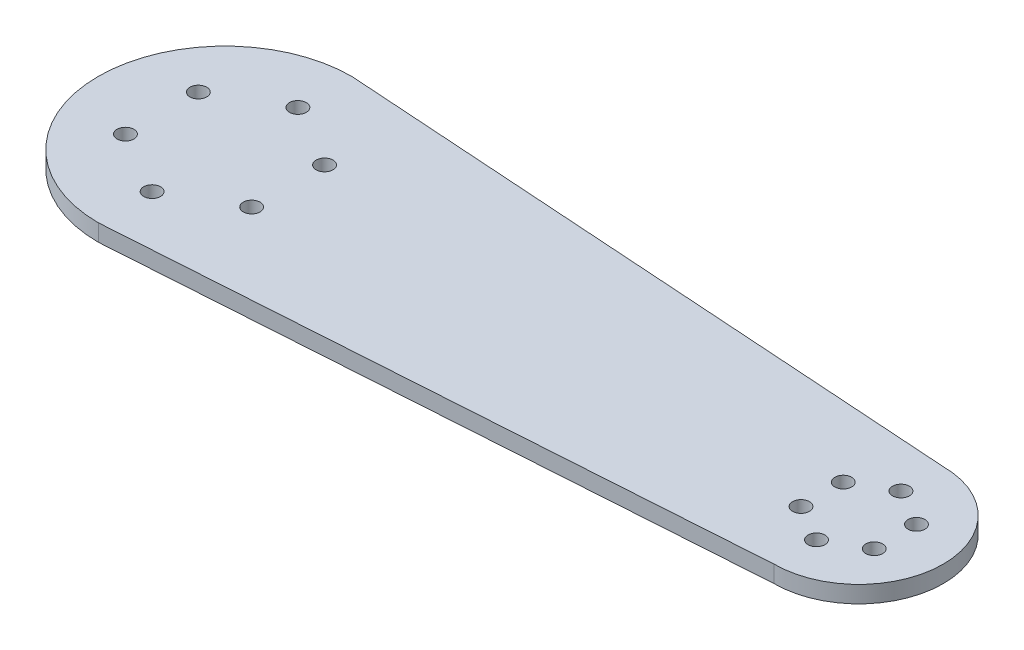
ISO-10303-21;
HEADER;
FILE_DESCRIPTION(('STEP AP214'),'2;1');
FILE_NAME('part.step','',(''),(''),'','','');
FILE_SCHEMA(('AUTOMOTIVE_DESIGN { 1 0 10303 214 1 1 1 1 }'));
ENDSEC;
DATA;
#1=APPLICATION_CONTEXT('core data for automotive mechanical design processes');
#2=APPLICATION_PROTOCOL_DEFINITION('international standard','automotive_design',2000,#1);
#3=PRODUCT_CONTEXT('',#1,'mechanical');
#4=PRODUCT('Part','Part','',(#3));
#5=PRODUCT_RELATED_PRODUCT_CATEGORY('part','',(#4));
#6=PRODUCT_DEFINITION_FORMATION('','',#4);
#7=PRODUCT_DEFINITION_CONTEXT('part definition',#1,'design');
#8=PRODUCT_DEFINITION('design','',#6,#7);
#9=PRODUCT_DEFINITION_SHAPE('','',#8);
#10=(LENGTH_UNIT() NAMED_UNIT(*) SI_UNIT(.MILLI.,.METRE.));
#11=(NAMED_UNIT(*) PLANE_ANGLE_UNIT() SI_UNIT($,.RADIAN.));
#12=(NAMED_UNIT(*) SI_UNIT($,.STERADIAN.) SOLID_ANGLE_UNIT());
#13=UNCERTAINTY_MEASURE_WITH_UNIT(LENGTH_MEASURE(1.E-05),#10,'distance_accuracy_value','');
#14=(GEOMETRIC_REPRESENTATION_CONTEXT(3) GLOBAL_UNCERTAINTY_ASSIGNED_CONTEXT((#13)) GLOBAL_UNIT_ASSIGNED_CONTEXT((#10,
#11,#12)) REPRESENTATION_CONTEXT('',''));
#15=CARTESIAN_POINT('',(0.,0.,0.));
#16=DIRECTION('',(0.,0.,1.));
#17=DIRECTION('',(1.,0.,0.));
#18=AXIS2_PLACEMENT_3D('',#15,#16,#17);
#19=CARTESIAN_POINT('',(1.99115044247788,4.,29.8672566371681));
#20=DIRECTION('',(-0.0665190105237739,0.,-0.997785157856609));
#21=DIRECTION('',(-0.997785157856609,0.,0.0665190105237739));
#22=AXIS2_PLACEMENT_3D('',#19,#20,#21);
#23=PLANE('',#22);
#24=DIRECTION('',(0.997785157856609,0.,-0.0665190105237739));
#25=VECTOR('',#24,1.);
#26=CARTESIAN_POINT('',(1.99115044247788,0.,29.8672566371681));
#27=LINE('',#26,#25);
#28=CARTESIAN_POINT('',(0.,0.,30.));
#29=VERTEX_POINT('',#28);
#30=CARTESIAN_POINT('',(150.,0.,20.));
#31=VERTEX_POINT('',#30);
#32=EDGE_CURVE('E164',#29,#31,#27,.T.);
#33=ORIENTED_EDGE('',*,*,#32,.T.);
#34=DIRECTION('',(0.,-1.,0.));
#35=VECTOR('',#34,1.);
#36=CARTESIAN_POINT('',(150.,4.,20.));
#37=LINE('',#36,#35);
#38=CARTESIAN_POINT('',(150.,4.,20.));
#39=VERTEX_POINT('',#38);
#40=EDGE_CURVE('E11',#39,#31,#37,.T.);
#41=ORIENTED_EDGE('',*,*,#40,.F.);
#42=DIRECTION('',(0.997785157856609,0.,-0.0665190105237739));
#43=VECTOR('',#42,1.);
#44=CARTESIAN_POINT('',(1.99115044247788,4.,29.8672566371681));
#45=LINE('',#44,#43);
#46=CARTESIAN_POINT('',(0.,4.,30.));
#47=VERTEX_POINT('',#46);
#48=EDGE_CURVE('E97',#47,#39,#45,.T.);
#49=ORIENTED_EDGE('',*,*,#48,.F.);
#50=DIRECTION('',(0.,-1.,0.));
#51=VECTOR('',#50,1.);
#52=CARTESIAN_POINT('',(0.,4.,30.));
#53=LINE('',#52,#51);
#54=EDGE_CURVE('E123',#47,#29,#53,.T.);
#55=ORIENTED_EDGE('',*,*,#54,.T.);
#56=EDGE_LOOP('',(#33,#41,#49,#55));
#57=FACE_BOUND('',#56,.T.);
#58=ADVANCED_FACE('F47',(#57),#23,.F.);
#59=CARTESIAN_POINT('',(150.,4.,0.));
#60=DIRECTION('',(0.,-1.,0.));
#61=DIRECTION('',(0.,0.,-1.));
#62=AXIS2_PLACEMENT_3D('',#59,#60,#61);
#63=CYLINDRICAL_SURFACE('',#62,20.);
#64=CARTESIAN_POINT('',(150.,0.,0.));
#65=DIRECTION('',(0.,1.,0.));
#66=DIRECTION('',(0.,0.,1.));
#67=AXIS2_PLACEMENT_3D('',#64,#65,#66);
#68=CIRCLE('',#67,20.);
#69=CARTESIAN_POINT('',(150.,0.,-20.));
#70=VERTEX_POINT('',#69);
#71=EDGE_CURVE('E103',#31,#70,#68,.T.);
#72=ORIENTED_EDGE('',*,*,#71,.T.);
#73=DIRECTION('',(0.,-1.,0.));
#74=VECTOR('',#73,1.);
#75=CARTESIAN_POINT('',(150.,4.,-20.));
#76=LINE('',#75,#74);
#77=CARTESIAN_POINT('',(150.,4.,-20.));
#78=VERTEX_POINT('',#77);
#79=EDGE_CURVE('E57',#78,#70,#76,.T.);
#80=ORIENTED_EDGE('',*,*,#79,.F.);
#81=CARTESIAN_POINT('',(150.,4.,0.));
#82=DIRECTION('',(0.,1.,0.));
#83=DIRECTION('',(0.,0.,1.));
#84=AXIS2_PLACEMENT_3D('',#81,#82,#83);
#85=CIRCLE('',#84,20.);
#86=EDGE_CURVE('E91',#39,#78,#85,.T.);
#87=ORIENTED_EDGE('',*,*,#86,.F.);
#88=ORIENTED_EDGE('',*,*,#40,.T.);
#89=EDGE_LOOP('',(#72,#80,#87,#88));
#90=FACE_BOUND('',#89,.T.);
#91=ADVANCED_FACE('F102',(#90),#63,.T.);
#92=CARTESIAN_POINT('',(1.99115044247788,4.,-29.8672566371681));
#93=DIRECTION('',(0.0665190105237739,0.,-0.997785157856609));
#94=DIRECTION('',(-0.997785157856609,0.,-0.0665190105237739));
#95=AXIS2_PLACEMENT_3D('',#92,#93,#94);
#96=PLANE('',#95);
#97=DIRECTION('',(0.997785157856609,0.,0.0665190105237739));
#98=VECTOR('',#97,1.);
#99=CARTESIAN_POINT('',(1.99115044247788,0.,-29.8672566371681));
#100=LINE('',#99,#98);
#101=CARTESIAN_POINT('',(0.,0.,-30.));
#102=VERTEX_POINT('',#101);
#103=EDGE_CURVE('E170',#102,#70,#100,.T.);
#104=ORIENTED_EDGE('',*,*,#103,.F.);
#105=DIRECTION('',(0.,-1.,0.));
#106=VECTOR('',#105,1.);
#107=CARTESIAN_POINT('',(0.,4.,-30.));
#108=LINE('',#107,#106);
#109=CARTESIAN_POINT('',(0.,4.,-30.));
#110=VERTEX_POINT('',#109);
#111=EDGE_CURVE('E81',#110,#102,#108,.T.);
#112=ORIENTED_EDGE('',*,*,#111,.F.);
#113=DIRECTION('',(0.997785157856609,0.,0.0665190105237739));
#114=VECTOR('',#113,1.);
#115=CARTESIAN_POINT('',(1.99115044247788,4.,-29.8672566371681));
#116=LINE('',#115,#114);
#117=EDGE_CURVE('E95',#110,#78,#116,.T.);
#118=ORIENTED_EDGE('',*,*,#117,.T.);
#119=ORIENTED_EDGE('',*,*,#79,.T.);
#120=EDGE_LOOP('',(#104,#112,#118,#119));
#121=FACE_BOUND('',#120,.T.);
#122=ADVANCED_FACE('F108',(#121),#96,.T.);
#123=CARTESIAN_POINT('',(-14.9389382152816,4.,8.62499999999986));
#124=DIRECTION('',(0.,-1.,0.));
#125=DIRECTION('',(0.,0.,-1.));
#126=AXIS2_PLACEMENT_3D('',#123,#124,#125);
#127=CYLINDRICAL_SURFACE('',#126,2.);
#128=CARTESIAN_POINT('',(-14.9389382152816,4.,8.62499999999986));
#129=DIRECTION('',(0.,1.,0.));
#130=DIRECTION('',(0.,0.,1.));
#131=AXIS2_PLACEMENT_3D('',#128,#129,#130);
#132=CIRCLE('',#131,2.);
#133=CARTESIAN_POINT('',(-14.9389382152816,4.,10.6249999999999));
#134=VERTEX_POINT('',#133);
#135=EDGE_CURVE('E112',#134,#134,#132,.T.);
#136=ORIENTED_EDGE('',*,*,#135,.T.);
#137=EDGE_LOOP('',(#136));
#138=FACE_BOUND('',#137,.T.);
#139=CARTESIAN_POINT('',(-14.9389382152816,0.,8.62499999999986));
#140=DIRECTION('',(0.,1.,0.));
#141=DIRECTION('',(0.,0.,1.));
#142=AXIS2_PLACEMENT_3D('',#139,#140,#141);
#143=CIRCLE('',#142,2.);
#144=CARTESIAN_POINT('',(-14.9389382152816,0.,10.6249999999999));
#145=VERTEX_POINT('',#144);
#146=EDGE_CURVE('E175',#145,#145,#143,.T.);
#147=ORIENTED_EDGE('',*,*,#146,.F.);
#148=EDGE_LOOP('',(#147));
#149=FACE_BOUND('',#148,.T.);
#150=ADVANCED_FACE('F446',(#138,#149),#127,.F.);
#151=CARTESIAN_POINT('',(0.,4.,0.));
#152=DIRECTION('',(0.,-1.,0.));
#153=DIRECTION('',(0.,0.,-1.));
#154=AXIS2_PLACEMENT_3D('',#151,#152,#153);
#155=CYLINDRICAL_SURFACE('',#154,30.);
#156=CARTESIAN_POINT('',(0.,0.,0.));
#157=DIRECTION('',(0.,1.,0.));
#158=DIRECTION('',(0.,0.,1.));
#159=AXIS2_PLACEMENT_3D('',#156,#157,#158);
#160=CIRCLE('',#159,30.);
#161=EDGE_CURVE('E84',#102,#29,#160,.T.);
#162=ORIENTED_EDGE('',*,*,#161,.T.);
#163=ORIENTED_EDGE('',*,*,#54,.F.);
#164=CARTESIAN_POINT('',(0.,4.,0.));
#165=DIRECTION('',(0.,1.,0.));
#166=DIRECTION('',(0.,0.,1.));
#167=AXIS2_PLACEMENT_3D('',#164,#165,#166);
#168=CIRCLE('',#167,30.);
#169=EDGE_CURVE('E65',#110,#47,#168,.T.);
#170=ORIENTED_EDGE('',*,*,#169,.F.);
#171=ORIENTED_EDGE('',*,*,#111,.T.);
#172=EDGE_LOOP('',(#162,#163,#170,#171));
#173=FACE_BOUND('',#172,.T.);
#174=ADVANCED_FACE('F224',(#173),#155,.T.);
#175=CARTESIAN_POINT('',(-1.20456106190088E-13,4.,17.25));
#176=DIRECTION('',(0.,-1.,0.));
#177=DIRECTION('',(0.,0.,-1.));
#178=AXIS2_PLACEMENT_3D('',#175,#176,#177);
#179=CYLINDRICAL_SURFACE('',#178,2.);
#180=CARTESIAN_POINT('',(-1.20456106190088E-13,4.,17.25));
#181=DIRECTION('',(0.,1.,0.));
#182=DIRECTION('',(0.,0.,1.));
#183=AXIS2_PLACEMENT_3D('',#180,#181,#182);
#184=CIRCLE('',#183,2.);
#185=CARTESIAN_POINT('',(-1.20456106190088E-13,4.,19.25));
#186=VERTEX_POINT('',#185);
#187=EDGE_CURVE('E321',#186,#186,#184,.T.);
#188=ORIENTED_EDGE('',*,*,#187,.T.);
#189=EDGE_LOOP('',(#188));
#190=FACE_BOUND('',#189,.T.);
#191=CARTESIAN_POINT('',(-1.20456106190088E-13,0.,17.25));
#192=DIRECTION('',(0.,1.,0.));
#193=DIRECTION('',(0.,0.,1.));
#194=AXIS2_PLACEMENT_3D('',#191,#192,#193);
#195=CIRCLE('',#194,2.);
#196=CARTESIAN_POINT('',(-1.20456106190088E-13,0.,19.25));
#197=VERTEX_POINT('',#196);
#198=EDGE_CURVE('E160',#197,#197,#195,.T.);
#199=ORIENTED_EDGE('',*,*,#198,.F.);
#200=EDGE_LOOP('',(#199));
#201=FACE_BOUND('',#200,.T.);
#202=ADVANCED_FACE('F220',(#190,#201),#179,.F.);
#203=CARTESIAN_POINT('',(14.9389382152815,4.,8.62500000000007));
#204=DIRECTION('',(0.,-1.,0.));
#205=DIRECTION('',(0.,0.,-1.));
#206=AXIS2_PLACEMENT_3D('',#203,#204,#205);
#207=CYLINDRICAL_SURFACE('',#206,2.);
#208=CARTESIAN_POINT('',(14.9389382152815,4.,8.62500000000007));
#209=DIRECTION('',(0.,1.,0.));
#210=DIRECTION('',(0.,0.,1.));
#211=AXIS2_PLACEMENT_3D('',#208,#209,#210);
#212=CIRCLE('',#211,2.);
#213=CARTESIAN_POINT('',(14.9389382152815,4.,10.6250000000001));
#214=VERTEX_POINT('',#213);
#215=EDGE_CURVE('E317',#214,#214,#212,.T.);
#216=ORIENTED_EDGE('',*,*,#215,.T.);
#217=EDGE_LOOP('',(#216));
#218=FACE_BOUND('',#217,.T.);
#219=CARTESIAN_POINT('',(14.9389382152815,0.,8.62500000000007));
#220=DIRECTION('',(0.,1.,0.));
#221=DIRECTION('',(0.,0.,1.));
#222=AXIS2_PLACEMENT_3D('',#219,#220,#221);
#223=CIRCLE('',#222,2.);
#224=CARTESIAN_POINT('',(14.9389382152815,0.,10.6250000000001));
#225=VERTEX_POINT('',#224);
#226=EDGE_CURVE('E156',#225,#225,#223,.T.);
#227=ORIENTED_EDGE('',*,*,#226,.F.);
#228=EDGE_LOOP('',(#227));
#229=FACE_BOUND('',#228,.T.);
#230=ADVANCED_FACE('F223',(#218,#229),#207,.F.);
#231=CARTESIAN_POINT('',(14.9389382152816,4.,-8.62499999999997));
#232=DIRECTION('',(0.,-1.,0.));
#233=DIRECTION('',(0.,0.,-1.));
#234=AXIS2_PLACEMENT_3D('',#231,#232,#233);
#235=CYLINDRICAL_SURFACE('',#234,2.);
#236=CARTESIAN_POINT('',(14.9389382152816,4.,-8.62499999999997));
#237=DIRECTION('',(0.,1.,0.));
#238=DIRECTION('',(0.,0.,1.));
#239=AXIS2_PLACEMENT_3D('',#236,#237,#238);
#240=CIRCLE('',#239,2.);
#241=CARTESIAN_POINT('',(14.9389382152816,4.,-6.62499999999996));
#242=VERTEX_POINT('',#241);
#243=EDGE_CURVE('E313',#242,#242,#240,.T.);
#244=ORIENTED_EDGE('',*,*,#243,.T.);
#245=EDGE_LOOP('',(#244));
#246=FACE_BOUND('',#245,.T.);
#247=CARTESIAN_POINT('',(14.9389382152816,0.,-8.62499999999997));
#248=DIRECTION('',(0.,1.,0.));
#249=DIRECTION('',(0.,0.,1.));
#250=AXIS2_PLACEMENT_3D('',#247,#248,#249);
#251=CIRCLE('',#250,2.);
#252=CARTESIAN_POINT('',(14.9389382152816,0.,-6.62499999999996));
#253=VERTEX_POINT('',#252);
#254=EDGE_CURVE('E152',#253,#253,#251,.T.);
#255=ORIENTED_EDGE('',*,*,#254,.F.);
#256=EDGE_LOOP('',(#255));
#257=FACE_BOUND('',#256,.T.);
#258=ADVANCED_FACE('F228',(#246,#257),#235,.F.);
#259=CARTESIAN_POINT('',(0.,4.,-17.25));
#260=DIRECTION('',(0.,-1.,0.));
#261=DIRECTION('',(0.,0.,-1.));
#262=AXIS2_PLACEMENT_3D('',#259,#260,#261);
#263=CYLINDRICAL_SURFACE('',#262,2.);
#264=CARTESIAN_POINT('',(0.,4.,-17.25));
#265=DIRECTION('',(0.,1.,0.));
#266=DIRECTION('',(0.,0.,1.));
#267=AXIS2_PLACEMENT_3D('',#264,#265,#266);
#268=CIRCLE('',#267,2.);
#269=CARTESIAN_POINT('',(0.,4.,-15.25));
#270=VERTEX_POINT('',#269);
#271=EDGE_CURVE('E309',#270,#270,#268,.T.);
#272=ORIENTED_EDGE('',*,*,#271,.T.);
#273=EDGE_LOOP('',(#272));
#274=FACE_BOUND('',#273,.T.);
#275=CARTESIAN_POINT('',(0.,0.,-17.25));
#276=DIRECTION('',(0.,1.,0.));
#277=DIRECTION('',(0.,0.,1.));
#278=AXIS2_PLACEMENT_3D('',#275,#276,#277);
#279=CIRCLE('',#278,2.);
#280=CARTESIAN_POINT('',(0.,0.,-15.25));
#281=VERTEX_POINT('',#280);
#282=EDGE_CURVE('E148',#281,#281,#279,.T.);
#283=ORIENTED_EDGE('',*,*,#282,.F.);
#284=EDGE_LOOP('',(#283));
#285=FACE_BOUND('',#284,.T.);
#286=ADVANCED_FACE('F232',(#274,#285),#263,.F.);
#287=CARTESIAN_POINT('',(-14.9389382152815,4.,-8.62500000000018));
#288=DIRECTION('',(0.,-1.,0.));
#289=DIRECTION('',(0.,0.,-1.));
#290=AXIS2_PLACEMENT_3D('',#287,#288,#289);
#291=CYLINDRICAL_SURFACE('',#290,2.);
#292=CARTESIAN_POINT('',(-14.9389382152815,4.,-8.62500000000018));
#293=DIRECTION('',(0.,1.,0.));
#294=DIRECTION('',(0.,0.,1.));
#295=AXIS2_PLACEMENT_3D('',#292,#293,#294);
#296=CIRCLE('',#295,2.);
#297=CARTESIAN_POINT('',(-14.9389382152815,4.,-6.62500000000017));
#298=VERTEX_POINT('',#297);
#299=EDGE_CURVE('E305',#298,#298,#296,.T.);
#300=ORIENTED_EDGE('',*,*,#299,.T.);
#301=EDGE_LOOP('',(#300));
#302=FACE_BOUND('',#301,.T.);
#303=CARTESIAN_POINT('',(-14.9389382152815,0.,-8.62500000000018));
#304=DIRECTION('',(0.,1.,0.));
#305=DIRECTION('',(0.,0.,1.));
#306=AXIS2_PLACEMENT_3D('',#303,#304,#305);
#307=CIRCLE('',#306,2.);
#308=CARTESIAN_POINT('',(-14.9389382152815,0.,-6.62500000000017));
#309=VERTEX_POINT('',#308);
#310=EDGE_CURVE('E144',#309,#309,#307,.T.);
#311=ORIENTED_EDGE('',*,*,#310,.F.);
#312=EDGE_LOOP('',(#311));
#313=FACE_BOUND('',#312,.T.);
#314=ADVANCED_FACE('F236',(#302,#313),#291,.F.);
#315=CARTESIAN_POINT('',(150.,4.,10.));
#316=DIRECTION('',(0.,-1.,0.));
#317=DIRECTION('',(0.,0.,-1.));
#318=AXIS2_PLACEMENT_3D('',#315,#316,#317);
#319=CYLINDRICAL_SURFACE('',#318,2.);
#320=CARTESIAN_POINT('',(150.,4.,10.));
#321=DIRECTION('',(0.,1.,0.));
#322=DIRECTION('',(0.,0.,1.));
#323=AXIS2_PLACEMENT_3D('',#320,#321,#322);
#324=CIRCLE('',#323,2.);
#325=CARTESIAN_POINT('',(150.,4.,12.));
#326=VERTEX_POINT('',#325);
#327=EDGE_CURVE('E301',#326,#326,#324,.T.);
#328=ORIENTED_EDGE('',*,*,#327,.T.);
#329=EDGE_LOOP('',(#328));
#330=FACE_BOUND('',#329,.T.);
#331=CARTESIAN_POINT('',(150.,0.,10.));
#332=DIRECTION('',(0.,1.,0.));
#333=DIRECTION('',(0.,0.,1.));
#334=AXIS2_PLACEMENT_3D('',#331,#332,#333);
#335=CIRCLE('',#334,2.);
#336=CARTESIAN_POINT('',(150.,0.,12.));
#337=VERTEX_POINT('',#336);
#338=EDGE_CURVE('E140',#337,#337,#335,.T.);
#339=ORIENTED_EDGE('',*,*,#338,.F.);
#340=EDGE_LOOP('',(#339));
#341=FACE_BOUND('',#340,.T.);
#342=ADVANCED_FACE('F240',(#330,#341),#319,.F.);
#343=CARTESIAN_POINT('',(158.660254037844,4.,5.));
#344=DIRECTION('',(0.,-1.,0.));
#345=DIRECTION('',(0.,0.,-1.));
#346=AXIS2_PLACEMENT_3D('',#343,#344,#345);
#347=CYLINDRICAL_SURFACE('',#346,2.);
#348=CARTESIAN_POINT('',(158.660254037844,4.,5.));
#349=DIRECTION('',(0.,1.,0.));
#350=DIRECTION('',(0.,0.,1.));
#351=AXIS2_PLACEMENT_3D('',#348,#349,#350);
#352=CIRCLE('',#351,2.);
#353=CARTESIAN_POINT('',(158.660254037844,4.,7.));
#354=VERTEX_POINT('',#353);
#355=EDGE_CURVE('E293',#354,#354,#352,.T.);
#356=ORIENTED_EDGE('',*,*,#355,.T.);
#357=EDGE_LOOP('',(#356));
#358=FACE_BOUND('',#357,.T.);
#359=CARTESIAN_POINT('',(158.660254037844,0.,5.));
#360=DIRECTION('',(0.,1.,0.));
#361=DIRECTION('',(0.,0.,1.));
#362=AXIS2_PLACEMENT_3D('',#359,#360,#361);
#363=CIRCLE('',#362,2.);
#364=CARTESIAN_POINT('',(158.660254037844,0.,7.));
#365=VERTEX_POINT('',#364);
#366=EDGE_CURVE('E136',#365,#365,#363,.T.);
#367=ORIENTED_EDGE('',*,*,#366,.F.);
#368=EDGE_LOOP('',(#367));
#369=FACE_BOUND('',#368,.T.);
#370=ADVANCED_FACE('F244',(#358,#369),#347,.F.);
#371=CARTESIAN_POINT('',(158.660254037844,4.,-5.));
#372=DIRECTION('',(0.,-1.,0.));
#373=DIRECTION('',(0.,0.,-1.));
#374=AXIS2_PLACEMENT_3D('',#371,#372,#373);
#375=CYLINDRICAL_SURFACE('',#374,2.);
#376=CARTESIAN_POINT('',(158.660254037844,4.,-5.));
#377=DIRECTION('',(0.,1.,0.));
#378=DIRECTION('',(0.,0.,1.));
#379=AXIS2_PLACEMENT_3D('',#376,#377,#378);
#380=CIRCLE('',#379,2.);
#381=CARTESIAN_POINT('',(158.660254037844,4.,-3.00000000000001));
#382=VERTEX_POINT('',#381);
#383=EDGE_CURVE('E288',#382,#382,#380,.T.);
#384=ORIENTED_EDGE('',*,*,#383,.T.);
#385=EDGE_LOOP('',(#384));
#386=FACE_BOUND('',#385,.T.);
#387=CARTESIAN_POINT('',(158.660254037844,0.,-5.));
#388=DIRECTION('',(0.,1.,0.));
#389=DIRECTION('',(0.,0.,1.));
#390=AXIS2_PLACEMENT_3D('',#387,#388,#389);
#391=CIRCLE('',#390,2.);
#392=CARTESIAN_POINT('',(158.660254037844,0.,-3.00000000000001));
#393=VERTEX_POINT('',#392);
#394=EDGE_CURVE('E132',#393,#393,#391,.T.);
#395=ORIENTED_EDGE('',*,*,#394,.F.);
#396=EDGE_LOOP('',(#395));
#397=FACE_BOUND('',#396,.T.);
#398=ADVANCED_FACE('F248',(#386,#397),#375,.F.);
#399=CARTESIAN_POINT('',(150.,4.,-10.));
#400=DIRECTION('',(0.,-1.,0.));
#401=DIRECTION('',(0.,0.,-1.));
#402=AXIS2_PLACEMENT_3D('',#399,#400,#401);
#403=CYLINDRICAL_SURFACE('',#402,2.);
#404=CARTESIAN_POINT('',(150.,4.,-10.));
#405=DIRECTION('',(0.,1.,0.));
#406=DIRECTION('',(0.,0.,1.));
#407=AXIS2_PLACEMENT_3D('',#404,#405,#406);
#408=CIRCLE('',#407,2.);
#409=CARTESIAN_POINT('',(150.,4.,-8.));
#410=VERTEX_POINT('',#409);
#411=EDGE_CURVE('E259',#410,#410,#408,.T.);
#412=ORIENTED_EDGE('',*,*,#411,.T.);
#413=EDGE_LOOP('',(#412));
#414=FACE_BOUND('',#413,.T.);
#415=CARTESIAN_POINT('',(150.,0.,-10.));
#416=DIRECTION('',(0.,1.,0.));
#417=DIRECTION('',(0.,0.,1.));
#418=AXIS2_PLACEMENT_3D('',#415,#416,#417);
#419=CIRCLE('',#418,2.);
#420=CARTESIAN_POINT('',(150.,0.,-8.));
#421=VERTEX_POINT('',#420);
#422=EDGE_CURVE('E128',#421,#421,#419,.T.);
#423=ORIENTED_EDGE('',*,*,#422,.F.);
#424=EDGE_LOOP('',(#423));
#425=FACE_BOUND('',#424,.T.);
#426=ADVANCED_FACE('F209',(#414,#425),#403,.F.);
#427=CARTESIAN_POINT('',(141.339745962156,4.,-5.00000000000002));
#428=DIRECTION('',(0.,-1.,0.));
#429=DIRECTION('',(0.,0.,-1.));
#430=AXIS2_PLACEMENT_3D('',#427,#428,#429);
#431=CYLINDRICAL_SURFACE('',#430,2.);
#432=CARTESIAN_POINT('',(141.339745962156,4.,-5.00000000000002));
#433=DIRECTION('',(0.,1.,0.));
#434=DIRECTION('',(0.,0.,1.));
#435=AXIS2_PLACEMENT_3D('',#432,#433,#434);
#436=CIRCLE('',#435,2.);
#437=CARTESIAN_POINT('',(141.339745962156,4.,-3.00000000000002));
#438=VERTEX_POINT('',#437);
#439=EDGE_CURVE('E183',#438,#438,#436,.T.);
#440=ORIENTED_EDGE('',*,*,#439,.T.);
#441=EDGE_LOOP('',(#440));
#442=FACE_BOUND('',#441,.T.);
#443=CARTESIAN_POINT('',(141.339745962156,0.,-5.00000000000002));
#444=DIRECTION('',(0.,1.,0.));
#445=DIRECTION('',(0.,0.,1.));
#446=AXIS2_PLACEMENT_3D('',#443,#444,#445);
#447=CIRCLE('',#446,2.);
#448=CARTESIAN_POINT('',(141.339745962156,0.,-3.00000000000002));
#449=VERTEX_POINT('',#448);
#450=EDGE_CURVE('E124',#449,#449,#447,.T.);
#451=ORIENTED_EDGE('',*,*,#450,.F.);
#452=EDGE_LOOP('',(#451));
#453=FACE_BOUND('',#452,.T.);
#454=ADVANCED_FACE('F49',(#442,#453),#431,.F.);
#455=CARTESIAN_POINT('',(141.339745962156,4.,4.99999999999999));
#456=DIRECTION('',(0.,-1.,0.));
#457=DIRECTION('',(0.,0.,-1.));
#458=AXIS2_PLACEMENT_3D('',#455,#456,#457);
#459=CYLINDRICAL_SURFACE('',#458,2.);
#460=CARTESIAN_POINT('',(141.339745962156,4.,4.99999999999999));
#461=DIRECTION('',(0.,1.,0.));
#462=DIRECTION('',(0.,0.,1.));
#463=AXIS2_PLACEMENT_3D('',#460,#461,#462);
#464=CIRCLE('',#463,2.);
#465=CARTESIAN_POINT('',(141.339745962156,4.,6.99999999999999));
#466=VERTEX_POINT('',#465);
#467=EDGE_CURVE('E119',#466,#466,#464,.T.);
#468=ORIENTED_EDGE('',*,*,#467,.T.);
#469=EDGE_LOOP('',(#468));
#470=FACE_BOUND('',#469,.T.);
#471=CARTESIAN_POINT('',(141.339745962156,0.,4.99999999999999));
#472=DIRECTION('',(0.,1.,0.));
#473=DIRECTION('',(0.,0.,1.));
#474=AXIS2_PLACEMENT_3D('',#471,#472,#473);
#475=CIRCLE('',#474,2.);
#476=CARTESIAN_POINT('',(141.339745962156,0.,6.99999999999999));
#477=VERTEX_POINT('',#476);
#478=EDGE_CURVE('E179',#477,#477,#475,.T.);
#479=ORIENTED_EDGE('',*,*,#478,.F.);
#480=EDGE_LOOP('',(#479));
#481=FACE_BOUND('',#480,.T.);
#482=ADVANCED_FACE('F199',(#470,#481),#459,.F.);
#483=CARTESIAN_POINT('',(0.,4.,0.));
#484=DIRECTION('',(0.,1.,0.));
#485=DIRECTION('',(0.,0.,1.));
#486=AXIS2_PLACEMENT_3D('',#483,#484,#485);
#487=PLANE('',#486);
#488=ORIENTED_EDGE('',*,*,#439,.F.);
#489=EDGE_LOOP('',(#488));
#490=FACE_BOUND('',#489,.T.);
#491=ORIENTED_EDGE('',*,*,#411,.F.);
#492=EDGE_LOOP('',(#491));
#493=FACE_BOUND('',#492,.T.);
#494=ORIENTED_EDGE('',*,*,#383,.F.);
#495=EDGE_LOOP('',(#494));
#496=FACE_BOUND('',#495,.T.);
#497=ORIENTED_EDGE('',*,*,#355,.F.);
#498=EDGE_LOOP('',(#497));
#499=FACE_BOUND('',#498,.T.);
#500=ORIENTED_EDGE('',*,*,#327,.F.);
#501=EDGE_LOOP('',(#500));
#502=FACE_BOUND('',#501,.T.);
#503=ORIENTED_EDGE('',*,*,#299,.F.);
#504=EDGE_LOOP('',(#503));
#505=FACE_BOUND('',#504,.T.);
#506=ORIENTED_EDGE('',*,*,#271,.F.);
#507=EDGE_LOOP('',(#506));
#508=FACE_BOUND('',#507,.T.);
#509=ORIENTED_EDGE('',*,*,#243,.F.);
#510=EDGE_LOOP('',(#509));
#511=FACE_BOUND('',#510,.T.);
#512=ORIENTED_EDGE('',*,*,#215,.F.);
#513=EDGE_LOOP('',(#512));
#514=FACE_BOUND('',#513,.T.);
#515=ORIENTED_EDGE('',*,*,#187,.F.);
#516=EDGE_LOOP('',(#515));
#517=FACE_BOUND('',#516,.T.);
#518=ORIENTED_EDGE('',*,*,#48,.T.);
#519=ORIENTED_EDGE('',*,*,#86,.T.);
#520=ORIENTED_EDGE('',*,*,#117,.F.);
#521=ORIENTED_EDGE('',*,*,#169,.T.);
#522=EDGE_LOOP('',(#518,#519,#520,#521));
#523=FACE_BOUND('',#522,.T.);
#524=ORIENTED_EDGE('',*,*,#135,.F.);
#525=EDGE_LOOP('',(#524));
#526=FACE_BOUND('',#525,.T.);
#527=ORIENTED_EDGE('',*,*,#467,.F.);
#528=EDGE_LOOP('',(#527));
#529=FACE_BOUND('',#528,.T.);
#530=ADVANCED_FACE('F92',(#490,#493,#496,#499,#502,#505,#508,#511,#514,#517,#523,#526,#529),
#487,.T.);
#531=CARTESIAN_POINT('',(0.,0.,0.));
#532=DIRECTION('',(0.,1.,0.));
#533=DIRECTION('',(0.,0.,1.));
#534=AXIS2_PLACEMENT_3D('',#531,#532,#533);
#535=PLANE('',#534);
#536=ORIENTED_EDGE('',*,*,#450,.T.);
#537=EDGE_LOOP('',(#536));
#538=FACE_BOUND('',#537,.T.);
#539=ORIENTED_EDGE('',*,*,#422,.T.);
#540=EDGE_LOOP('',(#539));
#541=FACE_BOUND('',#540,.T.);
#542=ORIENTED_EDGE('',*,*,#394,.T.);
#543=EDGE_LOOP('',(#542));
#544=FACE_BOUND('',#543,.T.);
#545=ORIENTED_EDGE('',*,*,#366,.T.);
#546=EDGE_LOOP('',(#545));
#547=FACE_BOUND('',#546,.T.);
#548=ORIENTED_EDGE('',*,*,#338,.T.);
#549=EDGE_LOOP('',(#548));
#550=FACE_BOUND('',#549,.T.);
#551=ORIENTED_EDGE('',*,*,#310,.T.);
#552=EDGE_LOOP('',(#551));
#553=FACE_BOUND('',#552,.T.);
#554=ORIENTED_EDGE('',*,*,#282,.T.);
#555=EDGE_LOOP('',(#554));
#556=FACE_BOUND('',#555,.T.);
#557=ORIENTED_EDGE('',*,*,#254,.T.);
#558=EDGE_LOOP('',(#557));
#559=FACE_BOUND('',#558,.T.);
#560=ORIENTED_EDGE('',*,*,#226,.T.);
#561=EDGE_LOOP('',(#560));
#562=FACE_BOUND('',#561,.T.);
#563=ORIENTED_EDGE('',*,*,#198,.T.);
#564=EDGE_LOOP('',(#563));
#565=FACE_BOUND('',#564,.T.);
#566=ORIENTED_EDGE('',*,*,#32,.F.);
#567=ORIENTED_EDGE('',*,*,#161,.F.);
#568=ORIENTED_EDGE('',*,*,#103,.T.);
#569=ORIENTED_EDGE('',*,*,#71,.F.);
#570=EDGE_LOOP('',(#566,#567,#568,#569));
#571=FACE_BOUND('',#570,.T.);
#572=ORIENTED_EDGE('',*,*,#146,.T.);
#573=EDGE_LOOP('',(#572));
#574=FACE_BOUND('',#573,.T.);
#575=ORIENTED_EDGE('',*,*,#478,.T.);
#576=EDGE_LOOP('',(#575));
#577=FACE_BOUND('',#576,.T.);
#578=ADVANCED_FACE('F190',(#538,#541,#544,#547,#550,#553,#556,#559,#562,#565,#571,#574,#577),
#535,.F.);
#579=CLOSED_SHELL('',(#58,#91,#122,#150,#174,#202,#230,#258,#286,#314,#342,#370,#398,#426,#454,
#482,#530,#578));
#580=MANIFOLD_SOLID_BREP('B2',#579);
#581=ADVANCED_BREP_SHAPE_REPRESENTATION('',(#18,#580),#14);
#582=SHAPE_DEFINITION_REPRESENTATION(#9,#581);
ENDSEC;
END-ISO-10303-21;
